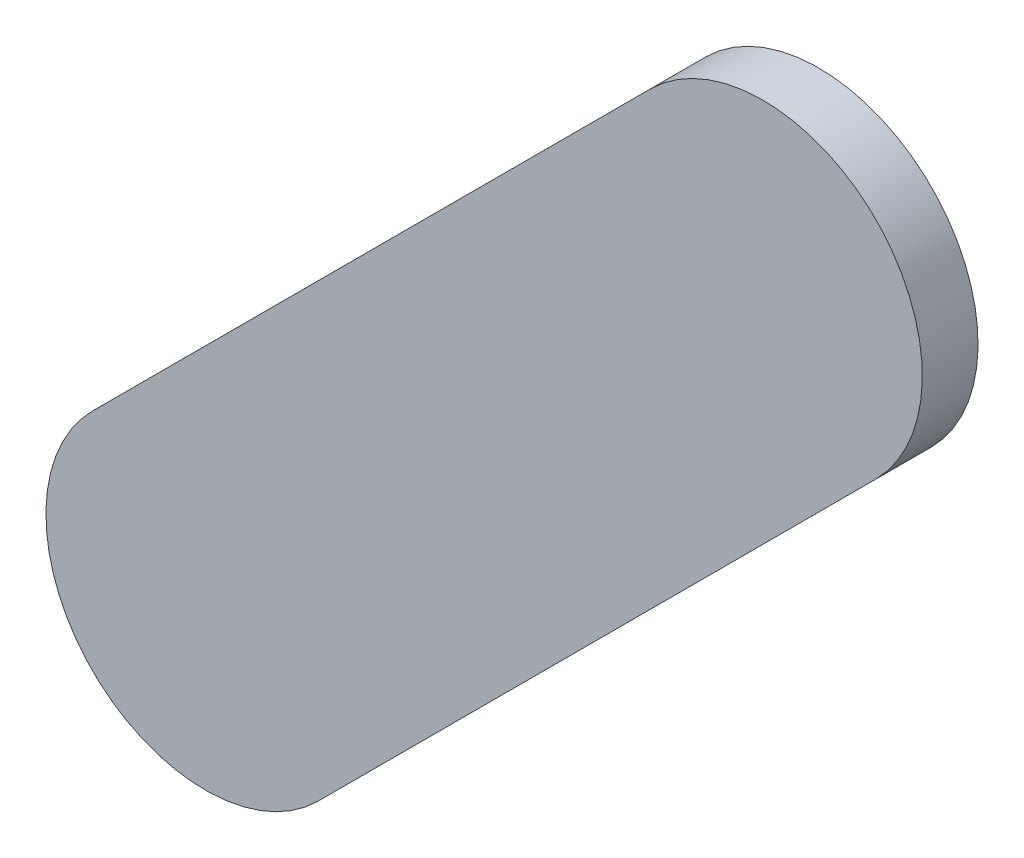
ISO-10303-21;
HEADER;
FILE_DESCRIPTION(('STEP AP214'),'2;1');
FILE_NAME('part.step','',(''),(''),'','','');
FILE_SCHEMA(('AUTOMOTIVE_DESIGN { 1 0 10303 214 1 1 1 1 }'));
ENDSEC;
DATA;
#1=APPLICATION_CONTEXT('core data for automotive mechanical design processes');
#2=APPLICATION_PROTOCOL_DEFINITION('international standard','automotive_design',2000,#1);
#3=PRODUCT_CONTEXT('',#1,'mechanical');
#4=PRODUCT('Part','Part','',(#3));
#5=PRODUCT_RELATED_PRODUCT_CATEGORY('part','',(#4));
#6=PRODUCT_DEFINITION_FORMATION('','',#4);
#7=PRODUCT_DEFINITION_CONTEXT('part definition',#1,'design');
#8=PRODUCT_DEFINITION('design','',#6,#7);
#9=PRODUCT_DEFINITION_SHAPE('','',#8);
#10=(LENGTH_UNIT() NAMED_UNIT(*) SI_UNIT(.MILLI.,.METRE.));
#11=(NAMED_UNIT(*) PLANE_ANGLE_UNIT() SI_UNIT($,.RADIAN.));
#12=(NAMED_UNIT(*) SI_UNIT($,.STERADIAN.) SOLID_ANGLE_UNIT());
#13=UNCERTAINTY_MEASURE_WITH_UNIT(LENGTH_MEASURE(1.E-05),#10,'distance_accuracy_value','');
#14=(GEOMETRIC_REPRESENTATION_CONTEXT(3) GLOBAL_UNCERTAINTY_ASSIGNED_CONTEXT((#13)) GLOBAL_UNIT_ASSIGNED_CONTEXT((#10,
#11,#12)) REPRESENTATION_CONTEXT('',''));
#15=CARTESIAN_POINT('',(0.,0.,0.));
#16=DIRECTION('',(0.,0.,1.));
#17=DIRECTION('',(1.,0.,0.));
#18=AXIS2_PLACEMENT_3D('',#15,#16,#17);
#19=CARTESIAN_POINT('',(82.379289,-116.679289,1.635));
#20=DIRECTION('',(0.,0.,1.));
#21=DIRECTION('',(1.,0.,0.));
#22=AXIS2_PLACEMENT_3D('',#19,#20,#21);
#23=PLANE('',#22);
#24=DIRECTION('',(-0.707106781186548,-0.707106781186548,0.));
#25=VECTOR('',#24,1.);
#26=CARTESIAN_POINT('',(82.379289,-116.679289,1.635));
#27=LINE('',#26,#25);
#28=CARTESIAN_POINT('',(82.379289,-116.679289,1.635));
#29=VERTEX_POINT('',#28);
#30=CARTESIAN_POINT('',(82.029289,-117.029289,1.635));
#31=VERTEX_POINT('',#30);
#32=EDGE_CURVE('E83',#29,#31,#27,.T.);
#33=ORIENTED_EDGE('',*,*,#32,.T.);
#34=CARTESIAN_POINT('',(82.0999995,-117.0999995,1.635));
#35=DIRECTION('',(0.,0.,1.));
#36=DIRECTION('',(-0.707106781186548,0.707106781186548,0.));
#37=AXIS2_PLACEMENT_3D('',#34,#35,#36);
#38=CIRCLE('',#37,0.09999974810218);
#39=CARTESIAN_POINT('',(82.17071,-117.17071,1.635));
#40=VERTEX_POINT('',#39);
#41=EDGE_CURVE('E98',#31,#40,#38,.T.);
#42=ORIENTED_EDGE('',*,*,#41,.T.);
#43=DIRECTION('',(0.707106781186548,0.707106781186548,0.));
#44=VECTOR('',#43,1.);
#45=CARTESIAN_POINT('',(82.17071,-117.17071,1.635));
#46=LINE('',#45,#44);
#47=CARTESIAN_POINT('',(82.52071,-116.82071,1.635));
#48=VERTEX_POINT('',#47);
#49=EDGE_CURVE('E76',#40,#48,#46,.T.);
#50=ORIENTED_EDGE('',*,*,#49,.T.);
#51=CARTESIAN_POINT('',(82.4499995,-116.7499995,1.635));
#52=DIRECTION('',(0.,0.,1.));
#53=DIRECTION('',(0.707106781186548,-0.707106781186548,0.));
#54=AXIS2_PLACEMENT_3D('',#51,#52,#53);
#55=CIRCLE('',#54,0.09999974810219);
#56=EDGE_CURVE('E11',#48,#29,#55,.T.);
#57=ORIENTED_EDGE('',*,*,#56,.T.);
#58=EDGE_LOOP('',(#33,#42,#50,#57));
#59=FACE_BOUND('',#58,.T.);
#60=ADVANCED_FACE('F17',(#59),#23,.T.);
#61=CARTESIAN_POINT('',(82.379289,-116.679289,1.6));
#62=DIRECTION('',(0.,0.,1.));
#63=DIRECTION('',(1.,0.,0.));
#64=AXIS2_PLACEMENT_3D('',#61,#62,#63);
#65=PLANE('',#64);
#66=CARTESIAN_POINT('',(82.4499995,-116.7499995,1.6));
#67=DIRECTION('',(0.,0.,1.));
#68=DIRECTION('',(0.707106781186548,-0.707106781186548,0.));
#69=AXIS2_PLACEMENT_3D('',#66,#67,#68);
#70=CIRCLE('',#69,0.09999974810219);
#71=CARTESIAN_POINT('',(82.52071,-116.82071,1.6));
#72=VERTEX_POINT('',#71);
#73=CARTESIAN_POINT('',(82.379289,-116.679289,1.6));
#74=VERTEX_POINT('',#73);
#75=EDGE_CURVE('E21',#72,#74,#70,.T.);
#76=ORIENTED_EDGE('',*,*,#75,.F.);
#77=DIRECTION('',(0.707106781186548,0.707106781186548,0.));
#78=VECTOR('',#77,1.);
#79=CARTESIAN_POINT('',(82.17071,-117.17071,1.6));
#80=LINE('',#79,#78);
#81=CARTESIAN_POINT('',(82.17071,-117.17071,1.6));
#82=VERTEX_POINT('',#81);
#83=EDGE_CURVE('E102',#82,#72,#80,.T.);
#84=ORIENTED_EDGE('',*,*,#83,.F.);
#85=CARTESIAN_POINT('',(82.0999995,-117.0999995,1.6));
#86=DIRECTION('',(0.,0.,1.));
#87=DIRECTION('',(-0.707106781186548,0.707106781186548,0.));
#88=AXIS2_PLACEMENT_3D('',#85,#86,#87);
#89=CIRCLE('',#88,0.09999974810218);
#90=CARTESIAN_POINT('',(82.029289,-117.029289,1.6));
#91=VERTEX_POINT('',#90);
#92=EDGE_CURVE('E85',#91,#82,#89,.T.);
#93=ORIENTED_EDGE('',*,*,#92,.F.);
#94=DIRECTION('',(-0.707106781186548,-0.707106781186548,0.));
#95=VECTOR('',#94,1.);
#96=CARTESIAN_POINT('',(82.379289,-116.679289,1.6));
#97=LINE('',#96,#95);
#98=EDGE_CURVE('E81',#74,#91,#97,.T.);
#99=ORIENTED_EDGE('',*,*,#98,.F.);
#100=EDGE_LOOP('',(#76,#84,#93,#99));
#101=FACE_BOUND('',#100,.T.);
#102=ADVANCED_FACE('F19',(#101),#65,.F.);
#103=CARTESIAN_POINT('',(82.4499995,-116.7499995,1.6));
#104=DIRECTION('',(0.,0.,-1.));
#105=DIRECTION('',(0.707106781186548,-0.707106781186548,0.));
#106=AXIS2_PLACEMENT_3D('',#103,#104,#105);
#107=CYLINDRICAL_SURFACE('',#106,0.09999974810219);
#108=ORIENTED_EDGE('',*,*,#75,.T.);
#109=DIRECTION('',(0.,0.,1.));
#110=VECTOR('',#109,1.);
#111=CARTESIAN_POINT('',(82.379289,-116.679289,1.6));
#112=LINE('',#111,#110);
#113=EDGE_CURVE('E70',#74,#29,#112,.T.);
#114=ORIENTED_EDGE('',*,*,#113,.T.);
#115=ORIENTED_EDGE('',*,*,#56,.F.);
#116=DIRECTION('',(0.,0.,1.));
#117=VECTOR('',#116,1.);
#118=CARTESIAN_POINT('',(82.52071,-116.82071,1.6));
#119=LINE('',#118,#117);
#120=EDGE_CURVE('E73',#72,#48,#119,.T.);
#121=ORIENTED_EDGE('',*,*,#120,.F.);
#122=EDGE_LOOP('',(#108,#114,#115,#121));
#123=FACE_BOUND('',#122,.T.);
#124=ADVANCED_FACE('F69',(#123),#107,.T.);
#125=CARTESIAN_POINT('',(82.17071,-117.17071,1.6));
#126=DIRECTION('',(-0.707106781186548,0.707106781186548,0.));
#127=DIRECTION('',(0.,0.,1.));
#128=AXIS2_PLACEMENT_3D('',#125,#126,#127);
#129=PLANE('',#128);
#130=ORIENTED_EDGE('',*,*,#83,.T.);
#131=ORIENTED_EDGE('',*,*,#120,.T.);
#132=ORIENTED_EDGE('',*,*,#49,.F.);
#133=DIRECTION('',(0.,0.,1.));
#134=VECTOR('',#133,1.);
#135=CARTESIAN_POINT('',(82.17071,-117.17071,1.6));
#136=LINE('',#135,#134);
#137=EDGE_CURVE('E103',#82,#40,#136,.T.);
#138=ORIENTED_EDGE('',*,*,#137,.F.);
#139=EDGE_LOOP('',(#130,#131,#132,#138));
#140=FACE_BOUND('',#139,.T.);
#141=ADVANCED_FACE('F120',(#140),#129,.F.);
#142=CARTESIAN_POINT('',(82.0999995,-117.0999995,1.6));
#143=DIRECTION('',(0.,0.,-1.));
#144=DIRECTION('',(-0.707106781186548,0.707106781186548,0.));
#145=AXIS2_PLACEMENT_3D('',#142,#143,#144);
#146=CYLINDRICAL_SURFACE('',#145,0.09999974810218);
#147=ORIENTED_EDGE('',*,*,#92,.T.);
#148=ORIENTED_EDGE('',*,*,#137,.T.);
#149=ORIENTED_EDGE('',*,*,#41,.F.);
#150=DIRECTION('',(0.,0.,1.));
#151=VECTOR('',#150,1.);
#152=CARTESIAN_POINT('',(82.029289,-117.029289,1.6));
#153=LINE('',#152,#151);
#154=EDGE_CURVE('E90',#91,#31,#153,.T.);
#155=ORIENTED_EDGE('',*,*,#154,.F.);
#156=EDGE_LOOP('',(#147,#148,#149,#155));
#157=FACE_BOUND('',#156,.T.);
#158=ADVANCED_FACE('F122',(#157),#146,.T.);
#159=CARTESIAN_POINT('',(82.379289,-116.679289,1.6));
#160=DIRECTION('',(0.707106781186548,-0.707106781186548,0.));
#161=DIRECTION('',(0.,0.,-1.));
#162=AXIS2_PLACEMENT_3D('',#159,#160,#161);
#163=PLANE('',#162);
#164=ORIENTED_EDGE('',*,*,#98,.T.);
#165=ORIENTED_EDGE('',*,*,#154,.T.);
#166=ORIENTED_EDGE('',*,*,#32,.F.);
#167=ORIENTED_EDGE('',*,*,#113,.F.);
#168=EDGE_LOOP('',(#164,#165,#166,#167));
#169=FACE_BOUND('',#168,.T.);
#170=ADVANCED_FACE('F79',(#169),#163,.F.);
#171=CLOSED_SHELL('',(#60,#102,#124,#141,#158,#170));
#172=MANIFOLD_SOLID_BREP('B1',#171);
#173=ADVANCED_BREP_SHAPE_REPRESENTATION('',(#18,#172),#14);
#174=SHAPE_DEFINITION_REPRESENTATION(#9,#173);
ENDSEC;
END-ISO-10303-21;
